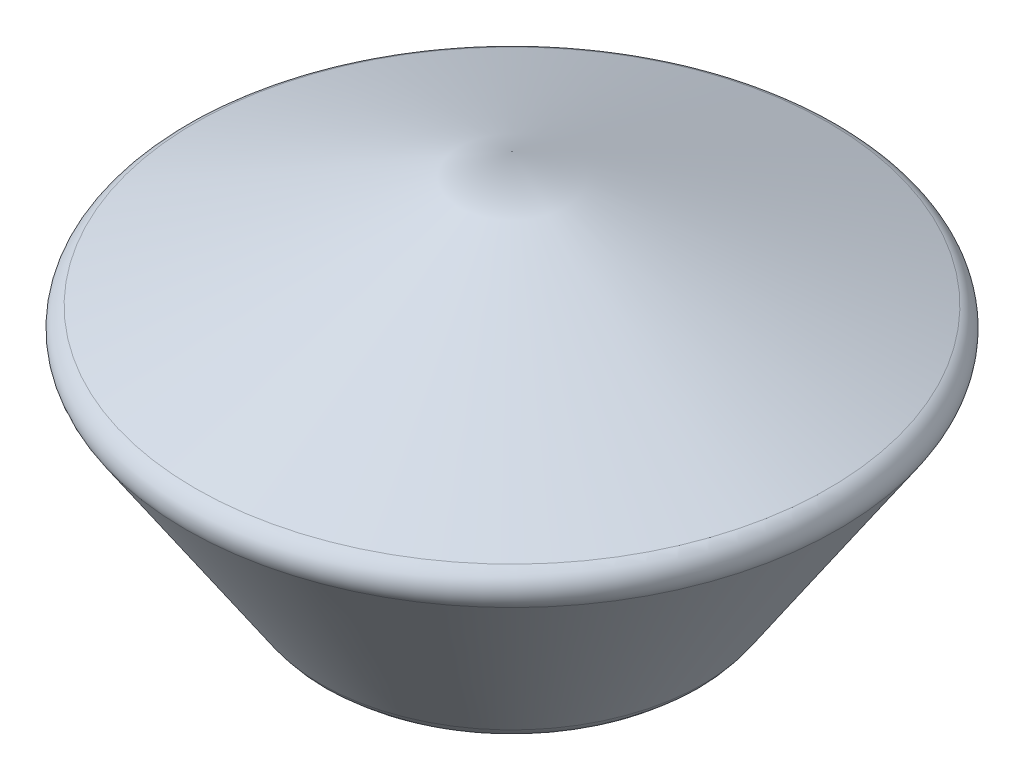
ISO-10303-21;
HEADER;
FILE_DESCRIPTION(('STEP AP214'),'2;1');
FILE_NAME('part.step','',(''),(''),'','','');
FILE_SCHEMA(('AUTOMOTIVE_DESIGN { 1 0 10303 214 1 1 1 1 }'));
ENDSEC;
DATA;
#1=APPLICATION_CONTEXT('core data for automotive mechanical design processes');
#2=APPLICATION_PROTOCOL_DEFINITION('international standard','automotive_design',2000,#1);
#3=PRODUCT_CONTEXT('',#1,'mechanical');
#4=PRODUCT('Part','Part','',(#3));
#5=PRODUCT_RELATED_PRODUCT_CATEGORY('part','',(#4));
#6=PRODUCT_DEFINITION_FORMATION('','',#4);
#7=PRODUCT_DEFINITION_CONTEXT('part definition',#1,'design');
#8=PRODUCT_DEFINITION('design','',#6,#7);
#9=PRODUCT_DEFINITION_SHAPE('','',#8);
#10=(LENGTH_UNIT() NAMED_UNIT(*) SI_UNIT(.MILLI.,.METRE.));
#11=(NAMED_UNIT(*) PLANE_ANGLE_UNIT() SI_UNIT($,.RADIAN.));
#12=(NAMED_UNIT(*) SI_UNIT($,.STERADIAN.) SOLID_ANGLE_UNIT());
#13=UNCERTAINTY_MEASURE_WITH_UNIT(LENGTH_MEASURE(1.E-05),#10,'distance_accuracy_value','');
#14=(GEOMETRIC_REPRESENTATION_CONTEXT(3) GLOBAL_UNCERTAINTY_ASSIGNED_CONTEXT((#13)) GLOBAL_UNIT_ASSIGNED_CONTEXT((#10,
#11,#12)) REPRESENTATION_CONTEXT('',''));
#15=CARTESIAN_POINT('',(0.,0.,0.));
#16=DIRECTION('',(0.,0.,1.));
#17=DIRECTION('',(1.,0.,0.));
#18=AXIS2_PLACEMENT_3D('',#15,#16,#17);
#19=CARTESIAN_POINT('',(0.,27.7182413686337,0.));
#20=DIRECTION('',(0.,1.,0.));
#21=DIRECTION('',(0.,0.,1.));
#22=AXIS2_PLACEMENT_3D('',#19,#20,#21);
#23=CONICAL_SURFACE('',#22,218.82316797195,0.590822117608884);
#24=CARTESIAN_POINT('',(0.,262.147801710792,0.));
#25=DIRECTION('',(0.,-1.,0.));
#26=DIRECTION('',(0.,0.,-1.));
#27=AXIS2_PLACEMENT_3D('',#24,#25,#26);
#28=CIRCLE('',#27,376.06608725788);
#29=CARTESIAN_POINT('',(0.,262.147801710792,-376.06608725788));
#30=VERTEX_POINT('',#29);
#31=EDGE_CURVE('E91',#30,#30,#28,.T.);
#32=ORIENTED_EDGE('',*,*,#31,.T.);
#33=EDGE_LOOP('',(#32));
#34=FACE_BOUND('',#33,.T.);
#35=CARTESIAN_POINT('',(0.,267.718241368634,0.));
#36=DIRECTION('',(0.,1.,0.));
#37=DIRECTION('',(0.,0.,1.));
#38=AXIS2_PLACEMENT_3D('',#35,#36,#37);
#39=CIRCLE('',#38,379.802442827659);
#40=CARTESIAN_POINT('',(0.,267.718241368634,379.802442827659));
#41=VERTEX_POINT('',#40);
#42=EDGE_CURVE('E13',#41,#41,#39,.T.);
#43=ORIENTED_EDGE('',*,*,#42,.T.);
#44=EDGE_LOOP('',(#43));
#45=FACE_BOUND('',#44,.T.);
#46=ADVANCED_FACE('F48',(#34,#45),#23,.F.);
#47=CARTESIAN_POINT('',(0.,276.073900855396,0.));
#48=DIRECTION('',(0.,1.,0.));
#49=DIRECTION('',(0.,0.,1.));
#50=AXIS2_PLACEMENT_3D('',#47,#48,#49);
#51=TOROIDAL_SURFACE('',#50,367.345197765396,15.);
#52=ORIENTED_EDGE('',*,*,#42,.F.);
#53=EDGE_LOOP('',(#52));
#54=FACE_BOUND('',#53,.T.);
#55=CARTESIAN_POINT('',(0.,289.896273804704,0.));
#56=DIRECTION('',(0.,1.,0.));
#57=DIRECTION('',(0.,0.,1.));
#58=AXIS2_PLACEMENT_3D('',#55,#56,#57);
#59=CIRCLE('',#58,373.171174597674);
#60=CARTESIAN_POINT('',(0.,289.896273804704,-373.171174597674));
#61=VERTEX_POINT('',#60);
#62=EDGE_CURVE('E56',#61,#61,#59,.T.);
#63=ORIENTED_EDGE('',*,*,#62,.T.);
#64=EDGE_LOOP('',(#63));
#65=FACE_BOUND('',#64,.T.);
#66=ADVANCED_FACE('F80',(#54,#65),#51,.F.);
#67=CARTESIAN_POINT('',(0.,289.896273804704,0.));
#68=DIRECTION('',(0.,-1.,0.));
#69=DIRECTION('',(0.,0.,-1.));
#70=AXIS2_PLACEMENT_3D('',#67,#68,#69);
#71=CONICAL_SURFACE('',#70,373.171174597674,1.17190336358868);
#72=CARTESIAN_POINT('',(0.,442.968894339329,0.));
#73=DIRECTION('',(0.,1.,0.));
#74=DIRECTION('',(0.,0.,1.));
#75=AXIS2_PLACEMENT_3D('',#72,#73,#74);
#76=CIRCLE('',#75,10.);
#77=CARTESIAN_POINT('',(0.,442.968894339329,-10.));
#78=VERTEX_POINT('',#77);
#79=EDGE_CURVE('E96',#78,#78,#76,.T.);
#80=CARTESIAN_POINT('',(0.,289.896273804704,-373.171174597674));
#81=CARTESIAN_POINT('',(0.,291.490780268606,-369.388141528949));
#82=CARTESIAN_POINT('',(0.,293.085286732508,-365.605108460223));
#83=CARTESIAN_POINT('',(0.,296.274299660313,-358.039042322771));
#84=CARTESIAN_POINT('',(0.,297.868806124215,-354.256009254046));
#85=CARTESIAN_POINT('',(0.,301.05781905202,-346.689943116594));
#86=CARTESIAN_POINT('',(0.,302.652325515922,-342.906910047868));
#87=CARTESIAN_POINT('',(0.,305.841338443727,-335.340843910417));
#88=CARTESIAN_POINT('',(0.,307.435844907629,-331.557810841691));
#89=CARTESIAN_POINT('',(0.,310.624857835434,-323.991744704239));
#90=CARTESIAN_POINT('',(0.,312.219364299337,-320.208711635514));
#91=CARTESIAN_POINT('',(0.,315.408377227141,-312.642645498062));
#92=CARTESIAN_POINT('',(0.,317.002883691044,-308.859612429336));
#93=CARTESIAN_POINT('',(0.,320.191896618848,-301.293546291885));
#94=CARTESIAN_POINT('',(0.,321.786403082751,-297.510513223159));
#95=CARTESIAN_POINT('',(0.,324.975416010555,-289.944447085707));
#96=CARTESIAN_POINT('',(0.,326.569922474458,-286.161414016982));
#97=CARTESIAN_POINT('',(0.,329.758935402262,-278.59534787953));
#98=CARTESIAN_POINT('',(0.,331.353441866165,-274.812314810804));
#99=CARTESIAN_POINT('',(0.,334.542454793969,-267.246248673353));
#100=CARTESIAN_POINT('',(0.,336.136961257872,-263.463215604627));
#101=CARTESIAN_POINT('',(0.,339.325974185676,-255.897149467175));
#102=CARTESIAN_POINT('',(0.,340.920480649579,-252.11411639845));
#103=CARTESIAN_POINT('',(0.,344.109493577384,-244.548050260998));
#104=CARTESIAN_POINT('',(0.,345.704000041286,-240.765017192272));
#105=CARTESIAN_POINT('',(0.,348.893012969091,-233.198951054821));
#106=CARTESIAN_POINT('',(0.,350.487519432993,-229.415917986095));
#107=CARTESIAN_POINT('',(0.,353.676532360798,-221.849851848643));
#108=CARTESIAN_POINT('',(0.,355.2710388247,-218.066818779918));
#109=CARTESIAN_POINT('',(0.,358.460051752505,-210.500752642466));
#110=CARTESIAN_POINT('',(0.,360.054558216407,-206.71771957374));
#111=CARTESIAN_POINT('',(0.,363.243571144212,-199.151653436289));
#112=CARTESIAN_POINT('',(0.,364.838077608114,-195.368620367563));
#113=CARTESIAN_POINT('',(0.,368.027090535919,-187.802554230111));
#114=CARTESIAN_POINT('',(0.,369.621596999821,-184.019521161386));
#115=CARTESIAN_POINT('',(0.,372.810609927626,-176.453455023934));
#116=CARTESIAN_POINT('',(0.,374.405116391528,-172.670421955208));
#117=CARTESIAN_POINT('',(0.,377.594129319333,-165.104355817757));
#118=CARTESIAN_POINT('',(0.,379.188635783235,-161.321322749031));
#119=CARTESIAN_POINT('',(0.,382.37764871104,-153.755256611579));
#120=CARTESIAN_POINT('',(0.,383.972155174942,-149.972223542854));
#121=CARTESIAN_POINT('',(0.,387.161168102747,-142.406157405402));
#122=CARTESIAN_POINT('',(0.,388.755674566649,-138.623124336676));
#123=CARTESIAN_POINT('',(0.,391.944687494454,-131.057058199225));
#124=CARTESIAN_POINT('',(0.,393.539193958356,-127.274025130499));
#125=CARTESIAN_POINT('',(0.,396.728206886161,-119.707958993047));
#126=CARTESIAN_POINT('',(0.,398.322713350063,-115.924925924322));
#127=CARTESIAN_POINT('',(0.,401.511726277868,-108.35885978687));
#128=CARTESIAN_POINT('',(0.,403.10623274177,-104.575826718144));
#129=CARTESIAN_POINT('',(0.,406.295245669575,-97.0097605806928));
#130=CARTESIAN_POINT('',(0.,407.889752133477,-93.2267275119671));
#131=CARTESIAN_POINT('',(0.,411.078765061282,-85.6606613745155));
#132=CARTESIAN_POINT('',(0.,412.673271525184,-81.8776283057897));
#133=CARTESIAN_POINT('',(0.,415.862284452989,-74.3115621683382));
#134=CARTESIAN_POINT('',(0.,417.456790916891,-70.5285290996124));
#135=CARTESIAN_POINT('',(0.,420.645803844696,-62.9624629621609));
#136=CARTESIAN_POINT('',(0.,422.240310308599,-59.1794298934351));
#137=CARTESIAN_POINT('',(0.,425.429323236403,-51.6133637559835));
#138=CARTESIAN_POINT('',(0.,427.023829700305,-47.8303306872578));
#139=CARTESIAN_POINT('',(0.,430.21284262811,-40.2642645498062));
#140=CARTESIAN_POINT('',(0.,431.807349092013,-36.4812314810804));
#141=CARTESIAN_POINT('',(0.,434.996362019817,-28.9151653436289));
#142=CARTESIAN_POINT('',(0.,436.59086848372,-25.1321322749031));
#143=CARTESIAN_POINT('',(0.,439.779881411524,-17.5660661374516));
#144=CARTESIAN_POINT('',(0.,441.374387875427,-13.7830330687258));
#145=CARTESIAN_POINT('',(0.,442.968894339329,-10.));
#146=B_SPLINE_CURVE_WITH_KNOTS('',3,(#80,#81,#82,#83,#84,#85,#86,#87,#88,#89,#90,#91,#92,#93,
#94,#95,#96,#97,#98,#99,#100,#101,#102,#103,#104,#105,#106,#107,#108,#109,#110,#111,#112,#113,
#114,#115,#116,#117,#118,#119,#120,#121,#122,#123,#124,#125,#126,#127,#128,#129,#130,#131,#132,
#133,#134,#135,#136,#137,#138,#139,#140,#141,#142,#143,#144,#145),.UNSPECIFIED.,.F.,.F.,(4,2,2,
2,2,2,2,2,2,2,2,2,2,2,2,2,2,2,2,2,2,2,2,2,2,2,2,2,2,2,2,2,4),(0.,12.316010334621,
24.6320206692421,36.9480310038631,49.2640413384841,61.5800516731052,73.8960620077262,
86.2120723423472,98.5280826769682,110.844093011589,123.16010334621,135.476113680831,
147.792124015452,160.108134350073,172.424144684694,184.740155019315,197.056165353937,
209.372175688558,221.688186023179,234.0041963578,246.320206692421,258.636217027042,
270.952227361663,283.268237696284,295.584248030905,307.900258365526,320.216268700147,
332.532279034768,344.848289369389,357.16429970401,369.480310038631,381.796320373252,
394.112330707873),.UNSPECIFIED.);
#147=EDGE_CURVE('BSEAM76',#61,#78,#146,.T.);
#148=ORIENTED_EDGE('',*,*,#62,.F.);
#149=ORIENTED_EDGE('',*,*,#79,.T.);
#150=ORIENTED_EDGE('',*,*,#147,.T.);
#151=ORIENTED_EDGE('',*,*,#147,.F.);
#152=EDGE_LOOP('',(#148,#150,#149,#151));
#153=FACE_BOUND('',#152,.T.);
#154=ADVANCED_FACE('F76',(#153),#71,.F.);
#155=CARTESIAN_POINT('',(-10.,442.968894339329,0.));
#156=DIRECTION('',(0.,-1.,0.));
#157=DIRECTION('',(0.,0.,-1.));
#158=AXIS2_PLACEMENT_3D('',#155,#156,#157);
#159=PLANE('',#158);
#160=ORIENTED_EDGE('',*,*,#79,.F.);
#161=EDGE_LOOP('',(#160));
#162=FACE_BOUND('',#161,.T.);
#163=ADVANCED_FACE('F70',(#162),#159,.T.);
#164=CARTESIAN_POINT('',(0.,262.147801710792,0.));
#165=DIRECTION('',(0.,-1.,0.));
#166=DIRECTION('',(0.,0.,-1.));
#167=AXIS2_PLACEMENT_3D('',#164,#165,#166);
#168=PLANE('',#167);
#169=ORIENTED_EDGE('',*,*,#31,.F.);
#170=EDGE_LOOP('',(#169));
#171=FACE_BOUND('',#170,.T.);
#172=CARTESIAN_POINT('',(0.,262.147801710792,0.));
#173=DIRECTION('',(0.,1.,0.));
#174=DIRECTION('',(0.,0.,1.));
#175=AXIS2_PLACEMENT_3D('',#172,#173,#174);
#176=CIRCLE('',#175,388.107272869168);
#177=CARTESIAN_POINT('',(0.,262.147801710792,388.107272869168));
#178=VERTEX_POINT('',#177);
#179=EDGE_CURVE('E52',#178,#178,#176,.T.);
#180=ORIENTED_EDGE('',*,*,#179,.F.);
#181=EDGE_LOOP('',(#180));
#182=FACE_BOUND('',#181,.T.);
#183=ADVANCED_FACE('F50',(#171,#182),#168,.T.);
#184=CARTESIAN_POINT('',(0.,458.035755079273,0.));
#185=DIRECTION('',(0.,-1.,0.));
#186=DIRECTION('',(0.,0.,-1.));
#187=AXIS2_PLACEMENT_3D('',#184,#185,#186);
#188=CONICAL_SURFACE('',#187,0.,1.17190336358868);
#189=CARTESIAN_POINT('',(0.,299.111189104242,0.));
#190=DIRECTION('',(0.,1.,0.));
#191=DIRECTION('',(0.,0.,1.));
#192=AXIS2_PLACEMENT_3D('',#189,#190,#191);
#193=CIRCLE('',#192,377.055159152527);
#194=CARTESIAN_POINT('',(0.,299.111189104242,377.055159152527));
#195=VERTEX_POINT('',#194);
#196=EDGE_CURVE('E99',#195,#195,#193,.T.);
#197=ORIENTED_EDGE('',*,*,#196,.T.);
#198=EDGE_LOOP('',(#197));
#199=FACE_BOUND('',#198,.T.);
#200=CARTESIAN_POINT('',(0.,458.035755079273,0.));
#201=VERTEX_POINT('',#200);
#202=VERTEX_LOOP('',#201);
#203=FACE_BOUND('',#202,.T.);
#204=ADVANCED_FACE('F59',(#199,#203),#188,.T.);
#205=CARTESIAN_POINT('',(0.,276.073900855396,0.));
#206=DIRECTION('',(0.,1.,0.));
#207=DIRECTION('',(0.,0.,1.));
#208=AXIS2_PLACEMENT_3D('',#205,#206,#207);
#209=TOROIDAL_SURFACE('',#208,367.345197765396,25.);
#210=ORIENTED_EDGE('',*,*,#179,.T.);
#211=EDGE_LOOP('',(#210));
#212=FACE_BOUND('',#211,.T.);
#213=ORIENTED_EDGE('',*,*,#196,.F.);
#214=EDGE_LOOP('',(#213));
#215=FACE_BOUND('',#214,.T.);
#216=ADVANCED_FACE('F61',(#212,#215),#209,.T.);
#217=CLOSED_SHELL('',(#46,#66,#154,#163,#183,#204,#216));
#218=MANIFOLD_SOLID_BREP('B2',#217);
#219=CARTESIAN_POINT('',(0.,27.7182413686337,0.));
#220=DIRECTION('',(0.,1.,0.));
#221=DIRECTION('',(0.,0.,1.));
#222=AXIS2_PLACEMENT_3D('',#219,#220,#221);
#223=CONICAL_SURFACE('',#222,218.82316797195,0.590822117608884);
#224=CARTESIAN_POINT('',(0.,267.718241368634,0.));
#225=DIRECTION('',(0.,1.,0.));
#226=DIRECTION('',(0.,0.,1.));
#227=AXIS2_PLACEMENT_3D('',#224,#225,#226);
#228=CIRCLE('',#227,379.802442827659);
#229=CARTESIAN_POINT('',(0.,267.718241368634,379.802442827659));
#230=VERTEX_POINT('',#229);
#231=EDGE_CURVE('E162',#230,#230,#228,.T.);
#232=ORIENTED_EDGE('',*,*,#231,.F.);
#233=EDGE_LOOP('',(#232));
#234=FACE_BOUND('',#233,.T.);
#235=CARTESIAN_POINT('',(0.,262.147801710792,0.));
#236=DIRECTION('',(0.,-1.,0.));
#237=DIRECTION('',(0.,0.,-1.));
#238=AXIS2_PLACEMENT_3D('',#235,#236,#237);
#239=CIRCLE('',#238,376.06608725788);
#240=CARTESIAN_POINT('',(0.,262.147801710792,-376.06608725788));
#241=VERTEX_POINT('',#240);
#242=EDGE_CURVE('E47',#241,#241,#239,.T.);
#243=ORIENTED_EDGE('',*,*,#242,.F.);
#244=EDGE_LOOP('',(#243));
#245=FACE_BOUND('',#244,.T.);
#246=ADVANCED_FACE('F158',(#234,#245),#223,.T.);
#247=CARTESIAN_POINT('',(0.,276.073900855396,0.));
#248=DIRECTION('',(0.,1.,0.));
#249=DIRECTION('',(0.,0.,1.));
#250=AXIS2_PLACEMENT_3D('',#247,#248,#249);
#251=TOROIDAL_SURFACE('',#250,367.345197765396,15.);
#252=CARTESIAN_POINT('',(0.,289.896273804704,0.));
#253=DIRECTION('',(0.,1.,0.));
#254=DIRECTION('',(0.,0.,1.));
#255=AXIS2_PLACEMENT_3D('',#252,#253,#254);
#256=CIRCLE('',#255,373.171174597674);
#257=CARTESIAN_POINT('',(0.,289.896273804704,-373.171174597674));
#258=VERTEX_POINT('',#257);
#259=EDGE_CURVE('E171',#258,#258,#256,.T.);
#260=ORIENTED_EDGE('',*,*,#259,.F.);
#261=EDGE_LOOP('',(#260));
#262=FACE_BOUND('',#261,.T.);
#263=ORIENTED_EDGE('',*,*,#231,.T.);
#264=EDGE_LOOP('',(#263));
#265=FACE_BOUND('',#264,.T.);
#266=ADVANCED_FACE('F179',(#262,#265),#251,.T.);
#267=CARTESIAN_POINT('',(0.,289.896273804704,0.));
#268=DIRECTION('',(0.,-1.,0.));
#269=DIRECTION('',(0.,0.,-1.));
#270=AXIS2_PLACEMENT_3D('',#267,#268,#269);
#271=CONICAL_SURFACE('',#270,373.171174597674,1.17190336358868);
#272=CARTESIAN_POINT('',(0.,442.968894339329,0.));
#273=DIRECTION('',(0.,1.,0.));
#274=DIRECTION('',(0.,0.,1.));
#275=AXIS2_PLACEMENT_3D('',#272,#273,#274);
#276=CIRCLE('',#275,10.);
#277=CARTESIAN_POINT('',(0.,442.968894339329,-10.));
#278=VERTEX_POINT('',#277);
#279=EDGE_CURVE('E166',#278,#278,#276,.T.);
#280=CARTESIAN_POINT('',(0.,442.968894339329,-10.));
#281=CARTESIAN_POINT('',(0.,441.374387875427,-13.7830330687258));
#282=CARTESIAN_POINT('',(0.,439.779881411524,-17.5660661374516));
#283=CARTESIAN_POINT('',(0.,436.59086848372,-25.1321322749031));
#284=CARTESIAN_POINT('',(0.,434.996362019817,-28.9151653436289));
#285=CARTESIAN_POINT('',(0.,431.807349092013,-36.4812314810804));
#286=CARTESIAN_POINT('',(0.,430.21284262811,-40.2642645498062));
#287=CARTESIAN_POINT('',(0.,427.023829700305,-47.8303306872578));
#288=CARTESIAN_POINT('',(0.,425.429323236403,-51.6133637559835));
#289=CARTESIAN_POINT('',(0.,422.240310308599,-59.1794298934351));
#290=CARTESIAN_POINT('',(0.,420.645803844696,-62.9624629621609));
#291=CARTESIAN_POINT('',(0.,417.456790916891,-70.5285290996124));
#292=CARTESIAN_POINT('',(0.,415.862284452989,-74.3115621683382));
#293=CARTESIAN_POINT('',(0.,412.673271525184,-81.8776283057897));
#294=CARTESIAN_POINT('',(0.,411.078765061282,-85.6606613745155));
#295=CARTESIAN_POINT('',(0.,407.889752133477,-93.2267275119671));
#296=CARTESIAN_POINT('',(0.,406.295245669575,-97.0097605806928));
#297=CARTESIAN_POINT('',(0.,403.10623274177,-104.575826718144));
#298=CARTESIAN_POINT('',(0.,401.511726277868,-108.35885978687));
#299=CARTESIAN_POINT('',(0.,398.322713350063,-115.924925924322));
#300=CARTESIAN_POINT('',(0.,396.728206886161,-119.707958993048));
#301=CARTESIAN_POINT('',(0.,393.539193958356,-127.274025130499));
#302=CARTESIAN_POINT('',(0.,391.944687494454,-131.057058199225));
#303=CARTESIAN_POINT('',(0.,388.755674566649,-138.623124336676));
#304=CARTESIAN_POINT('',(0.,387.161168102747,-142.406157405402));
#305=CARTESIAN_POINT('',(0.,383.972155174942,-149.972223542854));
#306=CARTESIAN_POINT('',(0.,382.37764871104,-153.755256611579));
#307=CARTESIAN_POINT('',(0.,379.188635783235,-161.321322749031));
#308=CARTESIAN_POINT('',(0.,377.594129319333,-165.104355817757));
#309=CARTESIAN_POINT('',(0.,374.405116391528,-172.670421955208));
#310=CARTESIAN_POINT('',(0.,372.810609927626,-176.453455023934));
#311=CARTESIAN_POINT('',(0.,369.621596999821,-184.019521161386));
#312=CARTESIAN_POINT('',(0.,368.027090535919,-187.802554230111));
#313=CARTESIAN_POINT('',(0.,364.838077608114,-195.368620367563));
#314=CARTESIAN_POINT('',(0.,363.243571144212,-199.151653436289));
#315=CARTESIAN_POINT('',(0.,360.054558216407,-206.71771957374));
#316=CARTESIAN_POINT('',(0.,358.460051752505,-210.500752642466));
#317=CARTESIAN_POINT('',(0.,355.2710388247,-218.066818779918));
#318=CARTESIAN_POINT('',(0.,353.676532360798,-221.849851848643));
#319=CARTESIAN_POINT('',(0.,350.487519432993,-229.415917986095));
#320=CARTESIAN_POINT('',(0.,348.893012969091,-233.198951054821));
#321=CARTESIAN_POINT('',(0.,345.704000041286,-240.765017192272));
#322=CARTESIAN_POINT('',(0.,344.109493577384,-244.548050260998));
#323=CARTESIAN_POINT('',(0.,340.920480649579,-252.11411639845));
#324=CARTESIAN_POINT('',(0.,339.325974185676,-255.897149467175));
#325=CARTESIAN_POINT('',(0.,336.136961257872,-263.463215604627));
#326=CARTESIAN_POINT('',(0.,334.542454793969,-267.246248673353));
#327=CARTESIAN_POINT('',(0.,331.353441866165,-274.812314810804));
#328=CARTESIAN_POINT('',(0.,329.758935402262,-278.59534787953));
#329=CARTESIAN_POINT('',(0.,326.569922474458,-286.161414016982));
#330=CARTESIAN_POINT('',(0.,324.975416010555,-289.944447085707));
#331=CARTESIAN_POINT('',(0.,321.786403082751,-297.510513223159));
#332=CARTESIAN_POINT('',(0.,320.191896618848,-301.293546291885));
#333=CARTESIAN_POINT('',(0.,317.002883691044,-308.859612429336));
#334=CARTESIAN_POINT('',(0.,315.408377227141,-312.642645498062));
#335=CARTESIAN_POINT('',(0.,312.219364299337,-320.208711635514));
#336=CARTESIAN_POINT('',(0.,310.624857835434,-323.991744704239));
#337=CARTESIAN_POINT('',(0.,307.43584490763,-331.557810841691));
#338=CARTESIAN_POINT('',(0.,305.841338443727,-335.340843910417));
#339=CARTESIAN_POINT('',(0.,302.652325515922,-342.906910047868));
#340=CARTESIAN_POINT('',(0.,301.05781905202,-346.689943116594));
#341=CARTESIAN_POINT('',(0.,297.868806124215,-354.256009254046));
#342=CARTESIAN_POINT('',(0.,296.274299660313,-358.039042322771));
#343=CARTESIAN_POINT('',(0.,293.085286732508,-365.605108460223));
#344=CARTESIAN_POINT('',(0.,291.490780268606,-369.388141528949));
#345=CARTESIAN_POINT('',(0.,289.896273804704,-373.171174597674));
#346=B_SPLINE_CURVE_WITH_KNOTS('',3,(#280,#281,#282,#283,#284,#285,#286,#287,#288,#289,#290,
#291,#292,#293,#294,#295,#296,#297,#298,#299,#300,#301,#302,#303,#304,#305,#306,#307,#308,#309,
#310,#311,#312,#313,#314,#315,#316,#317,#318,#319,#320,#321,#322,#323,#324,#325,#326,#327,#328,
#329,#330,#331,#332,#333,#334,#335,#336,#337,#338,#339,#340,#341,#342,#343,#344,#345),
.UNSPECIFIED.,.F.,.F.,(4,2,2,2,2,2,2,2,2,2,2,2,2,2,2,2,2,2,2,2,2,2,2,2,2,2,2,2,2,2,2,2,4),(0.,
12.316010334621,24.6320206692421,36.9480310038631,49.2640413384841,61.5800516731052,
73.8960620077262,86.2120723423473,98.5280826769683,110.844093011589,123.16010334621,
135.476113680831,147.792124015452,160.108134350073,172.424144684694,184.740155019315,
197.056165353937,209.372175688558,221.688186023179,234.0041963578,246.320206692421,
258.636217027042,270.952227361663,283.268237696284,295.584248030905,307.900258365526,
320.216268700147,332.532279034768,344.848289369389,357.16429970401,369.480310038631,
381.796320373252,394.112330707873),.UNSPECIFIED.);
#347=EDGE_CURVE('BSEAM186',#278,#258,#346,.T.);
#348=ORIENTED_EDGE('',*,*,#279,.F.);
#349=ORIENTED_EDGE('',*,*,#259,.T.);
#350=ORIENTED_EDGE('',*,*,#347,.T.);
#351=ORIENTED_EDGE('',*,*,#347,.F.);
#352=EDGE_LOOP('',(#348,#350,#349,#351));
#353=FACE_BOUND('',#352,.T.);
#354=ADVANCED_FACE('F186',(#353),#271,.T.);
#355=CARTESIAN_POINT('',(-10.,442.968894339329,0.));
#356=DIRECTION('',(0.,-1.,0.));
#357=DIRECTION('',(0.,0.,-1.));
#358=AXIS2_PLACEMENT_3D('',#355,#356,#357);
#359=PLANE('',#358);
#360=ORIENTED_EDGE('',*,*,#279,.T.);
#361=EDGE_LOOP('',(#360));
#362=FACE_BOUND('',#361,.T.);
#363=ADVANCED_FACE('F192',(#362),#359,.F.);
#364=CARTESIAN_POINT('',(0.,262.147801710792,0.));
#365=DIRECTION('',(0.,-1.,0.));
#366=DIRECTION('',(0.,0.,-1.));
#367=AXIS2_PLACEMENT_3D('',#364,#365,#366);
#368=PLANE('',#367);
#369=ORIENTED_EDGE('',*,*,#242,.T.);
#370=EDGE_LOOP('',(#369));
#371=FACE_BOUND('',#370,.T.);
#372=ADVANCED_FACE('F160',(#371),#368,.T.);
#373=CLOSED_SHELL('',(#246,#266,#354,#363,#372));
#374=MANIFOLD_SOLID_BREP('B7',#373);
#375=CARTESIAN_POINT('',(0.,262.147801710792,0.));
#376=DIRECTION('',(0.,-1.,0.));
#377=DIRECTION('',(0.,0.,-1.));
#378=AXIS2_PLACEMENT_3D('',#375,#376,#377);
#379=PLANE('',#378);
#380=CARTESIAN_POINT('',(0.,262.147801710792,0.));
#381=DIRECTION('',(0.,1.,0.));
#382=DIRECTION('',(0.,0.,1.));
#383=AXIS2_PLACEMENT_3D('',#380,#381,#382);
#384=CIRCLE('',#383,388.107272869168);
#385=CARTESIAN_POINT('',(0.,262.147801710792,388.107272869168));
#386=VERTEX_POINT('',#385);
#387=EDGE_CURVE('E239',#386,#386,#384,.T.);
#388=ORIENTED_EDGE('',*,*,#387,.T.);
#389=EDGE_LOOP('',(#388));
#390=FACE_BOUND('',#389,.T.);
#391=CARTESIAN_POINT('',(0.,262.147801710792,0.));
#392=DIRECTION('',(0.,-1.,0.));
#393=DIRECTION('',(0.,0.,-1.));
#394=AXIS2_PLACEMENT_3D('',#391,#392,#393);
#395=CIRCLE('',#394,376.06608725788);
#396=CARTESIAN_POINT('',(0.,262.147801710792,-376.06608725788));
#397=VERTEX_POINT('',#396);
#398=EDGE_CURVE('E252',#397,#397,#395,.T.);
#399=ORIENTED_EDGE('',*,*,#398,.T.);
#400=EDGE_LOOP('',(#399));
#401=FACE_BOUND('',#400,.T.);
#402=ADVANCED_FACE('F235',(#390,#401),#379,.F.);
#403=CARTESIAN_POINT('',(-10.,10.,0.));
#404=DIRECTION('',(0.,1.,0.));
#405=DIRECTION('',(0.,0.,1.));
#406=AXIS2_PLACEMENT_3D('',#403,#404,#405);
#407=PLANE('',#406);
#408=CARTESIAN_POINT('',(0.,10.,0.));
#409=DIRECTION('',(0.,1.,0.));
#410=DIRECTION('',(0.,0.,1.));
#411=AXIS2_PLACEMENT_3D('',#408,#409,#410);
#412=CIRCLE('',#411,185.603847805915);
#413=CARTESIAN_POINT('',(0.,10.,185.603847805915));
#414=VERTEX_POINT('',#413);
#415=EDGE_CURVE('E157',#414,#414,#412,.T.);
#416=ORIENTED_EDGE('',*,*,#415,.T.);
#417=EDGE_LOOP('',(#416));
#418=FACE_BOUND('',#417,.T.);
#419=ADVANCED_FACE('F237',(#418),#407,.T.);
#420=CARTESIAN_POINT('',(0.,50.,0.));
#421=DIRECTION('',(0.,1.,0.));
#422=DIRECTION('',(0.,0.,1.));
#423=AXIS2_PLACEMENT_3D('',#420,#421,#422);
#424=TOROIDAL_SURFACE('',#423,185.603847805915,40.);
#425=ORIENTED_EDGE('',*,*,#415,.F.);
#426=EDGE_LOOP('',(#425));
#427=FACE_BOUND('',#426,.T.);
#428=CARTESIAN_POINT('',(0.,27.7182413686337,0.));
#429=DIRECTION('',(0.,1.,0.));
#430=DIRECTION('',(0.,0.,1.));
#431=AXIS2_PLACEMENT_3D('',#428,#429,#430);
#432=CIRCLE('',#431,218.82316797195);
#433=CARTESIAN_POINT('',(0.,27.7182413686337,218.82316797195));
#434=VERTEX_POINT('',#433);
#435=EDGE_CURVE('E243',#434,#434,#432,.T.);
#436=ORIENTED_EDGE('',*,*,#435,.T.);
#437=EDGE_LOOP('',(#436));
#438=FACE_BOUND('',#437,.T.);
#439=ADVANCED_FACE('F277',(#427,#438),#424,.F.);
#440=CARTESIAN_POINT('',(0.,27.7182413686337,0.));
#441=DIRECTION('',(0.,1.,0.));
#442=DIRECTION('',(0.,0.,1.));
#443=AXIS2_PLACEMENT_3D('',#440,#441,#442);
#444=CONICAL_SURFACE('',#443,218.82316797195,0.590822117608884);
#445=ORIENTED_EDGE('',*,*,#435,.F.);
#446=EDGE_LOOP('',(#445));
#447=FACE_BOUND('',#446,.T.);
#448=ORIENTED_EDGE('',*,*,#398,.F.);
#449=EDGE_LOOP('',(#448));
#450=FACE_BOUND('',#449,.T.);
#451=ADVANCED_FACE('F267',(#447,#450),#444,.F.);
#452=CARTESIAN_POINT('',(0.,0.,0.));
#453=DIRECTION('',(0.,-1.,0.));
#454=DIRECTION('',(0.,0.,-1.));
#455=AXIS2_PLACEMENT_3D('',#452,#453,#454);
#456=PLANE('',#455);
#457=CARTESIAN_POINT('',(0.,0.,0.));
#458=DIRECTION('',(0.,1.,0.));
#459=DIRECTION('',(0.,0.,1.));
#460=AXIS2_PLACEMENT_3D('',#457,#458,#459);
#461=CIRCLE('',#460,185.603847805915);
#462=CARTESIAN_POINT('',(0.,0.,185.603847805915));
#463=VERTEX_POINT('',#462);
#464=EDGE_CURVE('E254',#463,#463,#461,.T.);
#465=ORIENTED_EDGE('',*,*,#464,.F.);
#466=EDGE_LOOP('',(#465));
#467=FACE_BOUND('',#466,.T.);
#468=ADVANCED_FACE('F271',(#467),#456,.T.);
#469=CARTESIAN_POINT('',(0.,50.,0.));
#470=DIRECTION('',(0.,1.,0.));
#471=DIRECTION('',(0.,0.,1.));
#472=AXIS2_PLACEMENT_3D('',#469,#470,#471);
#473=TOROIDAL_SURFACE('',#472,185.603847805915,50.);
#474=ORIENTED_EDGE('',*,*,#464,.T.);
#475=EDGE_LOOP('',(#474));
#476=FACE_BOUND('',#475,.T.);
#477=CARTESIAN_POINT('',(0.,22.1478017107921,0.));
#478=DIRECTION('',(0.,1.,0.));
#479=DIRECTION('',(0.,0.,1.));
#480=AXIS2_PLACEMENT_3D('',#477,#478,#479);
#481=CIRCLE('',#480,227.127998013459);
#482=CARTESIAN_POINT('',(0.,22.1478017107921,227.127998013459));
#483=VERTEX_POINT('',#482);
#484=EDGE_CURVE('E248',#483,#483,#481,.T.);
#485=ORIENTED_EDGE('',*,*,#484,.F.);
#486=EDGE_LOOP('',(#485));
#487=FACE_BOUND('',#486,.T.);
#488=ADVANCED_FACE('F264',(#476,#487),#473,.T.);
#489=CARTESIAN_POINT('',(0.,262.147801710792,0.));
#490=DIRECTION('',(0.,1.,0.));
#491=DIRECTION('',(0.,0.,1.));
#492=AXIS2_PLACEMENT_3D('',#489,#490,#491);
#493=CONICAL_SURFACE('',#492,388.107272869168,0.590822117608884);
#494=ORIENTED_EDGE('',*,*,#484,.T.);
#495=EDGE_LOOP('',(#494));
#496=FACE_BOUND('',#495,.T.);
#497=ORIENTED_EDGE('',*,*,#387,.F.);
#498=EDGE_LOOP('',(#497));
#499=FACE_BOUND('',#498,.T.);
#500=ADVANCED_FACE('F262',(#496,#499),#493,.T.);
#501=CLOSED_SHELL('',(#402,#419,#439,#451,#468,#488,#500));
#502=MANIFOLD_SOLID_BREP('B42',#501);
#503=CARTESIAN_POINT('',(-10.,10.,0.));
#504=DIRECTION('',(0.,1.,0.));
#505=DIRECTION('',(0.,0.,1.));
#506=AXIS2_PLACEMENT_3D('',#503,#504,#505);
#507=PLANE('',#506);
#508=CARTESIAN_POINT('',(0.,10.,0.));
#509=DIRECTION('',(0.,1.,0.));
#510=DIRECTION('',(0.,0.,1.));
#511=AXIS2_PLACEMENT_3D('',#508,#509,#510);
#512=CIRCLE('',#511,185.603847805915);
#513=CARTESIAN_POINT('',(0.,10.,185.603847805915));
#514=VERTEX_POINT('',#513);
#515=EDGE_CURVE('E234',#514,#514,#512,.T.);
#516=ORIENTED_EDGE('',*,*,#515,.F.);
#517=EDGE_LOOP('',(#516));
#518=FACE_BOUND('',#517,.T.);
#519=ADVANCED_FACE('F338',(#518),#507,.F.);
#520=CARTESIAN_POINT('',(0.,50.,0.));
#521=DIRECTION('',(0.,1.,0.));
#522=DIRECTION('',(0.,0.,1.));
#523=AXIS2_PLACEMENT_3D('',#520,#521,#522);
#524=TOROIDAL_SURFACE('',#523,185.603847805915,40.);
#525=CARTESIAN_POINT('',(0.,27.7182413686337,0.));
#526=DIRECTION('',(0.,1.,0.));
#527=DIRECTION('',(0.,0.,1.));
#528=AXIS2_PLACEMENT_3D('',#525,#526,#527);
#529=CIRCLE('',#528,218.82316797195);
#530=CARTESIAN_POINT('',(0.,27.7182413686337,218.82316797195));
#531=VERTEX_POINT('',#530);
#532=EDGE_CURVE('E346',#531,#531,#529,.T.);
#533=ORIENTED_EDGE('',*,*,#532,.F.);
#534=EDGE_LOOP('',(#533));
#535=FACE_BOUND('',#534,.T.);
#536=ORIENTED_EDGE('',*,*,#515,.T.);
#537=EDGE_LOOP('',(#536));
#538=FACE_BOUND('',#537,.T.);
#539=ADVANCED_FACE('F362',(#535,#538),#524,.T.);
#540=CARTESIAN_POINT('',(0.,27.7182413686337,0.));
#541=DIRECTION('',(0.,1.,0.));
#542=DIRECTION('',(0.,0.,1.));
#543=AXIS2_PLACEMENT_3D('',#540,#541,#542);
#544=CONICAL_SURFACE('',#543,218.82316797195,0.590822117608884);
#545=CARTESIAN_POINT('',(0.,262.147801710792,0.));
#546=DIRECTION('',(0.,-1.,0.));
#547=DIRECTION('',(0.,0.,-1.));
#548=AXIS2_PLACEMENT_3D('',#545,#546,#547);
#549=CIRCLE('',#548,376.06608725788);
#550=CARTESIAN_POINT('',(0.,262.147801710792,-376.06608725788));
#551=VERTEX_POINT('',#550);
#552=EDGE_CURVE('E342',#551,#551,#549,.T.);
#553=ORIENTED_EDGE('',*,*,#552,.T.);
#554=EDGE_LOOP('',(#553));
#555=FACE_BOUND('',#554,.T.);
#556=ORIENTED_EDGE('',*,*,#532,.T.);
#557=EDGE_LOOP('',(#556));
#558=FACE_BOUND('',#557,.T.);
#559=ADVANCED_FACE('F356',(#555,#558),#544,.T.);
#560=CARTESIAN_POINT('',(0.,262.147801710792,0.));
#561=DIRECTION('',(0.,-1.,0.));
#562=DIRECTION('',(0.,0.,-1.));
#563=AXIS2_PLACEMENT_3D('',#560,#561,#562);
#564=PLANE('',#563);
#565=ORIENTED_EDGE('',*,*,#552,.F.);
#566=EDGE_LOOP('',(#565));
#567=FACE_BOUND('',#566,.T.);
#568=ADVANCED_FACE('F340',(#567),#564,.F.);
#569=CLOSED_SHELL('',(#519,#539,#559,#568));
#570=MANIFOLD_SOLID_BREP('B152',#569);
#571=ADVANCED_BREP_SHAPE_REPRESENTATION('',(#18,#218,#374,#502,#570),#14);
#572=SHAPE_DEFINITION_REPRESENTATION(#9,#571);
ENDSEC;
END-ISO-10303-21;
